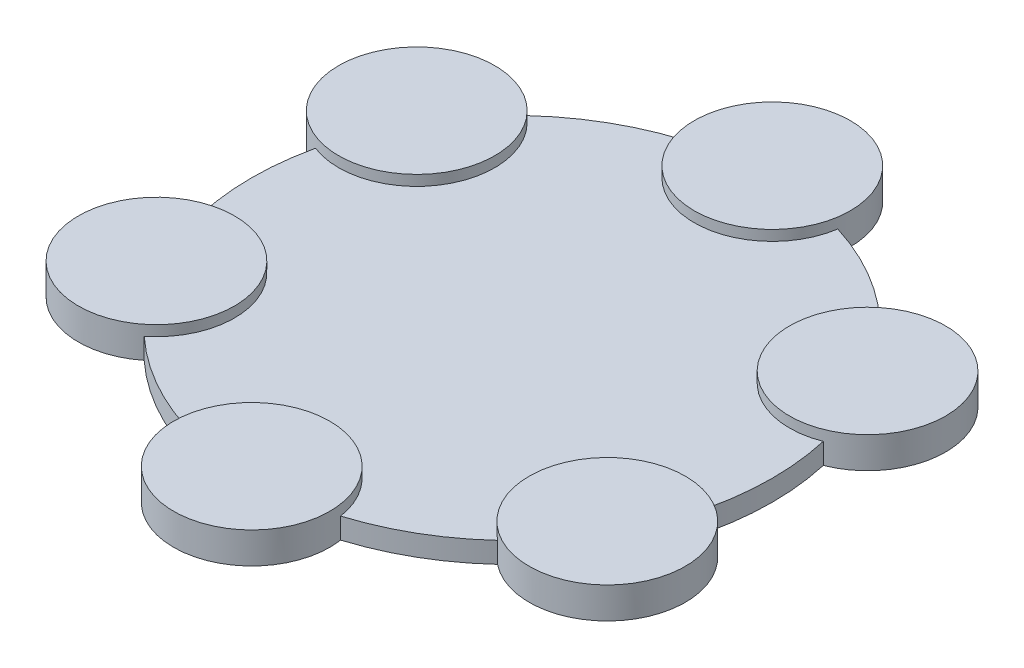
ISO-10303-21;
HEADER;
FILE_DESCRIPTION(('STEP AP214'),'2;1');
FILE_NAME('part.step','',(''),(''),'','','');
FILE_SCHEMA(('AUTOMOTIVE_DESIGN { 1 0 10303 214 1 1 1 1 }'));
ENDSEC;
DATA;
#1=APPLICATION_CONTEXT('core data for automotive mechanical design processes');
#2=APPLICATION_PROTOCOL_DEFINITION('international standard','automotive_design',2000,#1);
#3=PRODUCT_CONTEXT('',#1,'mechanical');
#4=PRODUCT('Part','Part','',(#3));
#5=PRODUCT_RELATED_PRODUCT_CATEGORY('part','',(#4));
#6=PRODUCT_DEFINITION_FORMATION('','',#4);
#7=PRODUCT_DEFINITION_CONTEXT('part definition',#1,'design');
#8=PRODUCT_DEFINITION('design','',#6,#7);
#9=PRODUCT_DEFINITION_SHAPE('','',#8);
#10=(LENGTH_UNIT() NAMED_UNIT(*) SI_UNIT(.MILLI.,.METRE.));
#11=(NAMED_UNIT(*) PLANE_ANGLE_UNIT() SI_UNIT($,.RADIAN.));
#12=(NAMED_UNIT(*) SI_UNIT($,.STERADIAN.) SOLID_ANGLE_UNIT());
#13=UNCERTAINTY_MEASURE_WITH_UNIT(LENGTH_MEASURE(1.E-05),#10,'distance_accuracy_value','');
#14=(GEOMETRIC_REPRESENTATION_CONTEXT(3) GLOBAL_UNCERTAINTY_ASSIGNED_CONTEXT((#13)) GLOBAL_UNIT_ASSIGNED_CONTEXT((#10,
#11,#12)) REPRESENTATION_CONTEXT('',''));
#15=CARTESIAN_POINT('',(0.,0.,0.));
#16=DIRECTION('',(0.,0.,1.));
#17=DIRECTION('',(1.,0.,0.));
#18=AXIS2_PLACEMENT_3D('',#15,#16,#17);
#19=CARTESIAN_POINT('',(0.,20.,0.));
#20=DIRECTION('',(0.,-1.,0.));
#21=DIRECTION('',(0.,0.,-1.));
#22=AXIS2_PLACEMENT_3D('',#19,#20,#21);
#23=CYLINDRICAL_SURFACE('',#22,250.);
#24=CARTESIAN_POINT('',(0.,0.,0.));
#25=DIRECTION('',(0.,1.,0.));
#26=DIRECTION('',(0.,0.,1.));
#27=AXIS2_PLACEMENT_3D('',#24,#25,#26);
#28=CIRCLE('',#27,250.);
#29=CARTESIAN_POINT('',(-243.839290028445,0.,-55.1579607892088));
#30=VERTEX_POINT('',#29);
#31=CARTESIAN_POINT('',(-243.839290028444,0.,55.1579607892139));
#32=VERTEX_POINT('',#31);
#33=EDGE_CURVE('E136',#30,#32,#28,.T.);
#34=ORIENTED_EDGE('',*,*,#33,.T.);
#35=DIRECTION('',(0.,-1.,0.));
#36=VECTOR('',#35,1.);
#37=CARTESIAN_POINT('',(-243.839290028444,15.,55.1579607892139));
#38=LINE('',#37,#36);
#39=CARTESIAN_POINT('',(-243.839290028444,20.,55.1579607892139));
#40=VERTEX_POINT('',#39);
#41=EDGE_CURVE('E134',#32,#40,#38,.F.);
#42=ORIENTED_EDGE('',*,*,#41,.T.);
#43=CARTESIAN_POINT('',(0.,20.,0.));
#44=DIRECTION('',(0.,1.,0.));
#45=DIRECTION('',(0.,0.,1.));
#46=AXIS2_PLACEMENT_3D('',#43,#44,#45);
#47=CIRCLE('',#46,250.);
#48=CARTESIAN_POINT('',(-243.839290028445,20.,-55.1579607892088));
#49=VERTEX_POINT('',#48);
#50=EDGE_CURVE('E125',#49,#40,#47,.T.);
#51=ORIENTED_EDGE('',*,*,#50,.F.);
#52=DIRECTION('',(0.,-1.,0.));
#53=VECTOR('',#52,1.);
#54=CARTESIAN_POINT('',(-243.839290028445,15.,-55.1579607892088));
#55=LINE('',#54,#53);
#56=EDGE_CURVE('E157',#49,#30,#55,.T.);
#57=ORIENTED_EDGE('',*,*,#56,.T.);
#58=EDGE_LOOP('',(#34,#42,#51,#57));
#59=FACE_BOUND('',#58,.T.);
#60=ADVANCED_FACE('F37',(#59),#23,.T.);
#61=CARTESIAN_POINT('',(-74.1514497498195,0.,-238.75));
#62=VERTEX_POINT('',#61);
#63=CARTESIAN_POINT('',(-169.687840278627,0.,-183.592039210787));
#64=VERTEX_POINT('',#63);
#65=EDGE_CURVE('E219',#62,#64,#28,.T.);
#66=ORIENTED_EDGE('',*,*,#65,.T.);
#67=DIRECTION('',(0.,-1.,0.));
#68=VECTOR('',#67,1.);
#69=CARTESIAN_POINT('',(-169.687840278627,15.,-183.592039210787));
#70=LINE('',#69,#68);
#71=CARTESIAN_POINT('',(-169.687840278627,20.,-183.592039210787));
#72=VERTEX_POINT('',#71);
#73=EDGE_CURVE('E159',#64,#72,#70,.F.);
#74=ORIENTED_EDGE('',*,*,#73,.T.);
#75=CARTESIAN_POINT('',(-74.1514497498195,20.,-238.75));
#76=VERTEX_POINT('',#75);
#77=EDGE_CURVE('E132',#76,#72,#47,.T.);
#78=ORIENTED_EDGE('',*,*,#77,.F.);
#79=DIRECTION('',(0.,-1.,0.));
#80=VECTOR('',#79,1.);
#81=CARTESIAN_POINT('',(-74.1514497498195,15.,-238.75));
#82=LINE('',#81,#80);
#83=EDGE_CURVE('E171',#76,#62,#82,.T.);
#84=ORIENTED_EDGE('',*,*,#83,.T.);
#85=EDGE_LOOP('',(#66,#74,#78,#84));
#86=FACE_BOUND('',#85,.T.);
#87=ADVANCED_FACE('F234',(#86),#23,.T.);
#88=CARTESIAN_POINT('',(169.687840278624,0.,-183.59203921079));
#89=VERTEX_POINT('',#88);
#90=CARTESIAN_POINT('',(74.1514497498195,0.,-238.75));
#91=VERTEX_POINT('',#90);
#92=EDGE_CURVE('E224',#89,#91,#28,.T.);
#93=ORIENTED_EDGE('',*,*,#92,.T.);
#94=DIRECTION('',(0.,-1.,0.));
#95=VECTOR('',#94,1.);
#96=CARTESIAN_POINT('',(74.1514497498195,15.,-238.75));
#97=LINE('',#96,#95);
#98=CARTESIAN_POINT('',(74.1514497498195,20.,-238.75));
#99=VERTEX_POINT('',#98);
#100=EDGE_CURVE('E173',#91,#99,#97,.F.);
#101=ORIENTED_EDGE('',*,*,#100,.T.);
#102=CARTESIAN_POINT('',(169.687840278624,20.,-183.59203921079));
#103=VERTEX_POINT('',#102);
#104=EDGE_CURVE('E255',#103,#99,#47,.T.);
#105=ORIENTED_EDGE('',*,*,#104,.F.);
#106=DIRECTION('',(0.,-1.,0.));
#107=VECTOR('',#106,1.);
#108=CARTESIAN_POINT('',(169.687840278624,15.,-183.59203921079));
#109=LINE('',#108,#107);
#110=EDGE_CURVE('E185',#103,#89,#109,.T.);
#111=ORIENTED_EDGE('',*,*,#110,.T.);
#112=EDGE_LOOP('',(#93,#101,#105,#111));
#113=FACE_BOUND('',#112,.T.);
#114=ADVANCED_FACE('F263',(#113),#23,.T.);
#115=CARTESIAN_POINT('',(243.839290028445,0.,55.1579607892105));
#116=VERTEX_POINT('',#115);
#117=CARTESIAN_POINT('',(243.839290028444,0.,-55.1579607892122));
#118=VERTEX_POINT('',#117);
#119=EDGE_CURVE('E220',#116,#118,#28,.T.);
#120=ORIENTED_EDGE('',*,*,#119,.T.);
#121=DIRECTION('',(0.,-1.,0.));
#122=VECTOR('',#121,1.);
#123=CARTESIAN_POINT('',(243.839290028444,15.,-55.1579607892122));
#124=LINE('',#123,#122);
#125=CARTESIAN_POINT('',(243.839290028444,20.,-55.1579607892122));
#126=VERTEX_POINT('',#125);
#127=EDGE_CURVE('E187',#118,#126,#124,.F.);
#128=ORIENTED_EDGE('',*,*,#127,.T.);
#129=CARTESIAN_POINT('',(243.839290028445,20.,55.1579607892105));
#130=VERTEX_POINT('',#129);
#131=EDGE_CURVE('E46',#130,#126,#47,.T.);
#132=ORIENTED_EDGE('',*,*,#131,.F.);
#133=DIRECTION('',(0.,-1.,0.));
#134=VECTOR('',#133,1.);
#135=CARTESIAN_POINT('',(243.839290028445,15.,55.1579607892105));
#136=LINE('',#135,#134);
#137=EDGE_CURVE('E199',#130,#116,#136,.T.);
#138=ORIENTED_EDGE('',*,*,#137,.T.);
#139=EDGE_LOOP('',(#120,#128,#132,#138));
#140=FACE_BOUND('',#139,.T.);
#141=ADVANCED_FACE('F254',(#140),#23,.T.);
#142=CARTESIAN_POINT('',(74.1514497498195,0.,238.75));
#143=VERTEX_POINT('',#142);
#144=CARTESIAN_POINT('',(169.687840278625,0.,183.592039210788));
#145=VERTEX_POINT('',#144);
#146=EDGE_CURVE('E41',#143,#145,#28,.T.);
#147=ORIENTED_EDGE('',*,*,#146,.T.);
#148=DIRECTION('',(0.,-1.,0.));
#149=VECTOR('',#148,1.);
#150=CARTESIAN_POINT('',(169.687840278625,15.,183.592039210789));
#151=LINE('',#150,#149);
#152=CARTESIAN_POINT('',(169.687840278625,20.,183.592039210788));
#153=VERTEX_POINT('',#152);
#154=EDGE_CURVE('E201',#145,#153,#151,.F.);
#155=ORIENTED_EDGE('',*,*,#154,.T.);
#156=CARTESIAN_POINT('',(74.1514497498195,20.,238.75));
#157=VERTEX_POINT('',#156);
#158=EDGE_CURVE('E11',#157,#153,#47,.T.);
#159=ORIENTED_EDGE('',*,*,#158,.F.);
#160=DIRECTION('',(0.,-1.,0.));
#161=VECTOR('',#160,1.);
#162=CARTESIAN_POINT('',(74.1514497498195,15.,238.75));
#163=LINE('',#162,#161);
#164=EDGE_CURVE('E213',#157,#143,#163,.T.);
#165=ORIENTED_EDGE('',*,*,#164,.T.);
#166=EDGE_LOOP('',(#147,#155,#159,#165));
#167=FACE_BOUND('',#166,.T.);
#168=ADVANCED_FACE('F248',(#167),#23,.T.);
#169=CARTESIAN_POINT('',(-169.687840278623,20.,183.592039210791));
#170=VERTEX_POINT('',#169);
#171=CARTESIAN_POINT('',(-74.1514497498195,20.,238.75));
#172=VERTEX_POINT('',#171);
#173=EDGE_CURVE('E47',#170,#172,#47,.T.);
#174=ORIENTED_EDGE('',*,*,#173,.F.);
#175=DIRECTION('',(0.,-1.,0.));
#176=VECTOR('',#175,1.);
#177=CARTESIAN_POINT('',(-169.687840278623,15.,183.592039210791));
#178=LINE('',#177,#176);
#179=CARTESIAN_POINT('',(-169.687840278623,0.,183.592039210791));
#180=VERTEX_POINT('',#179);
#181=EDGE_CURVE('E61',#170,#180,#178,.T.);
#182=ORIENTED_EDGE('',*,*,#181,.T.);
#183=CARTESIAN_POINT('',(-74.1514497498195,0.,238.75));
#184=VERTEX_POINT('',#183);
#185=EDGE_CURVE('E217',#180,#184,#28,.T.);
#186=ORIENTED_EDGE('',*,*,#185,.T.);
#187=DIRECTION('',(0.,-1.,0.));
#188=VECTOR('',#187,1.);
#189=CARTESIAN_POINT('',(-74.1514497498195,15.,238.75));
#190=LINE('',#189,#188);
#191=EDGE_CURVE('E215',#184,#172,#190,.F.);
#192=ORIENTED_EDGE('',*,*,#191,.T.);
#193=EDGE_LOOP('',(#174,#182,#186,#192));
#194=FACE_BOUND('',#193,.T.);
#195=ADVANCED_FACE('F39',(#194),#23,.T.);
#196=CARTESIAN_POINT('',(0.,20.,0.));
#197=DIRECTION('',(0.,1.,0.));
#198=DIRECTION('',(0.,0.,1.));
#199=AXIS2_PLACEMENT_3D('',#196,#197,#198);
#200=PLANE('',#199);
#201=CARTESIAN_POINT('',(-216.506350946108,20.,125.000000000003));
#202=DIRECTION('',(0.,1.,0.));
#203=DIRECTION('',(0.,0.,1.));
#204=AXIS2_PLACEMENT_3D('',#201,#202,#203);
#205=CIRCLE('',#204,75.);
#206=EDGE_CURVE('E54',#170,#40,#205,.T.);
#207=ORIENTED_EDGE('',*,*,#206,.F.);
#208=ORIENTED_EDGE('',*,*,#173,.T.);
#209=CARTESIAN_POINT('',(0.,20.,250.));
#210=DIRECTION('',(0.,1.,0.));
#211=DIRECTION('',(0.,0.,1.));
#212=AXIS2_PLACEMENT_3D('',#209,#210,#211);
#213=CIRCLE('',#212,75.);
#214=EDGE_CURVE('E208',#157,#172,#213,.T.);
#215=ORIENTED_EDGE('',*,*,#214,.F.);
#216=ORIENTED_EDGE('',*,*,#158,.T.);
#217=CARTESIAN_POINT('',(216.50635094611,20.,124.999999999999));
#218=DIRECTION('',(0.,1.,0.));
#219=DIRECTION('',(0.,0.,1.));
#220=AXIS2_PLACEMENT_3D('',#217,#218,#219);
#221=CIRCLE('',#220,75.);
#222=EDGE_CURVE('E194',#130,#153,#221,.T.);
#223=ORIENTED_EDGE('',*,*,#222,.F.);
#224=ORIENTED_EDGE('',*,*,#131,.T.);
#225=CARTESIAN_POINT('',(216.506350946109,20.,-125.000000000001));
#226=DIRECTION('',(0.,1.,0.));
#227=DIRECTION('',(0.,0.,1.));
#228=AXIS2_PLACEMENT_3D('',#225,#226,#227);
#229=CIRCLE('',#228,75.);
#230=EDGE_CURVE('E180',#103,#126,#229,.T.);
#231=ORIENTED_EDGE('',*,*,#230,.F.);
#232=ORIENTED_EDGE('',*,*,#104,.T.);
#233=CARTESIAN_POINT('',(0.,20.,-250.));
#234=DIRECTION('',(0.,1.,0.));
#235=DIRECTION('',(0.,0.,1.));
#236=AXIS2_PLACEMENT_3D('',#233,#234,#235);
#237=CIRCLE('',#236,75.);
#238=EDGE_CURVE('E166',#76,#99,#237,.T.);
#239=ORIENTED_EDGE('',*,*,#238,.F.);
#240=ORIENTED_EDGE('',*,*,#77,.T.);
#241=CARTESIAN_POINT('',(-216.506350946111,20.,-124.999999999998));
#242=DIRECTION('',(0.,1.,0.));
#243=DIRECTION('',(0.,0.,1.));
#244=AXIS2_PLACEMENT_3D('',#241,#242,#243);
#245=CIRCLE('',#244,75.);
#246=EDGE_CURVE('E129',#49,#72,#245,.T.);
#247=ORIENTED_EDGE('',*,*,#246,.F.);
#248=ORIENTED_EDGE('',*,*,#50,.T.);
#249=EDGE_LOOP('',(#207,#208,#215,#216,#223,#224,#231,#232,#239,#240,#247,#248));
#250=FACE_BOUND('',#249,.T.);
#251=ADVANCED_FACE('F127',(#250),#200,.T.);
#252=CARTESIAN_POINT('',(0.,0.,0.));
#253=DIRECTION('',(0.,1.,0.));
#254=DIRECTION('',(0.,0.,1.));
#255=AXIS2_PLACEMENT_3D('',#252,#253,#254);
#256=PLANE('',#255);
#257=ORIENTED_EDGE('',*,*,#185,.F.);
#258=CARTESIAN_POINT('',(-216.506350946108,0.,125.000000000003));
#259=DIRECTION('',(0.,-1.,0.));
#260=DIRECTION('',(0.866025403784433,0.,-0.50000000000001));
#261=AXIS2_PLACEMENT_3D('',#258,#259,#260);
#262=CIRCLE('',#261,75.);
#263=EDGE_CURVE('E147',#180,#32,#262,.T.);
#264=ORIENTED_EDGE('',*,*,#263,.T.);
#265=ORIENTED_EDGE('',*,*,#33,.F.);
#266=CARTESIAN_POINT('',(-216.506350946111,0.,-124.999999999998));
#267=DIRECTION('',(0.,-1.,0.));
#268=DIRECTION('',(0.866025403784443,0.,0.499999999999992));
#269=AXIS2_PLACEMENT_3D('',#266,#267,#268);
#270=CIRCLE('',#269,75.);
#271=EDGE_CURVE('E140',#30,#64,#270,.T.);
#272=ORIENTED_EDGE('',*,*,#271,.T.);
#273=ORIENTED_EDGE('',*,*,#65,.F.);
#274=CARTESIAN_POINT('',(0.,0.,-250.));
#275=DIRECTION('',(0.,-1.,0.));
#276=DIRECTION('',(0.,0.,1.));
#277=AXIS2_PLACEMENT_3D('',#274,#275,#276);
#278=CIRCLE('',#277,75.);
#279=EDGE_CURVE('E162',#62,#91,#278,.T.);
#280=ORIENTED_EDGE('',*,*,#279,.T.);
#281=ORIENTED_EDGE('',*,*,#92,.F.);
#282=CARTESIAN_POINT('',(216.506350946109,0.,-125.000000000001));
#283=DIRECTION('',(0.,-1.,0.));
#284=DIRECTION('',(-0.866025403784436,0.,0.500000000000004));
#285=AXIS2_PLACEMENT_3D('',#282,#283,#284);
#286=CIRCLE('',#285,75.);
#287=EDGE_CURVE('E176',#89,#118,#286,.T.);
#288=ORIENTED_EDGE('',*,*,#287,.T.);
#289=ORIENTED_EDGE('',*,*,#119,.F.);
#290=CARTESIAN_POINT('',(216.50635094611,0.,124.999999999999));
#291=DIRECTION('',(0.,-1.,0.));
#292=DIRECTION('',(-0.86602540378444,0.,-0.499999999999998));
#293=AXIS2_PLACEMENT_3D('',#290,#291,#292);
#294=CIRCLE('',#293,75.);
#295=EDGE_CURVE('E190',#116,#145,#294,.T.);
#296=ORIENTED_EDGE('',*,*,#295,.T.);
#297=ORIENTED_EDGE('',*,*,#146,.F.);
#298=CARTESIAN_POINT('',(0.,0.,250.));
#299=DIRECTION('',(0.,-1.,0.));
#300=DIRECTION('',(0.,0.,-1.));
#301=AXIS2_PLACEMENT_3D('',#298,#299,#300);
#302=CIRCLE('',#301,75.);
#303=EDGE_CURVE('E204',#143,#184,#302,.T.);
#304=ORIENTED_EDGE('',*,*,#303,.T.);
#305=EDGE_LOOP('',(#257,#264,#265,#272,#273,#280,#281,#288,#289,#296,#297,#304));
#306=FACE_BOUND('',#305,.T.);
#307=ADVANCED_FACE('F242',(#306),#256,.F.);
#308=CARTESIAN_POINT('',(0.,30.,250.));
#309=DIRECTION('',(0.,-1.,0.));
#310=DIRECTION('',(0.,0.,-1.));
#311=AXIS2_PLACEMENT_3D('',#308,#309,#310);
#312=CYLINDRICAL_SURFACE('',#311,75.);
#313=CARTESIAN_POINT('',(0.,30.,250.));
#314=DIRECTION('',(0.,-1.,0.));
#315=DIRECTION('',(0.,0.,-1.));
#316=AXIS2_PLACEMENT_3D('',#313,#314,#315);
#317=CIRCLE('',#316,75.);
#318=CARTESIAN_POINT('',(0.,30.,175.));
#319=VERTEX_POINT('',#318);
#320=EDGE_CURVE('E205',#319,#319,#317,.T.);
#321=ORIENTED_EDGE('',*,*,#320,.T.);
#322=EDGE_LOOP('',(#321));
#323=FACE_BOUND('',#322,.T.);
#324=ORIENTED_EDGE('',*,*,#191,.F.);
#325=ORIENTED_EDGE('',*,*,#303,.F.);
#326=ORIENTED_EDGE('',*,*,#164,.F.);
#327=ORIENTED_EDGE('',*,*,#214,.T.);
#328=EDGE_LOOP('',(#324,#325,#326,#327));
#329=FACE_BOUND('',#328,.T.);
#330=ADVANCED_FACE('F246',(#323,#329),#312,.T.);
#331=CARTESIAN_POINT('',(0.,30.,250.));
#332=DIRECTION('',(0.,-1.,0.));
#333=DIRECTION('',(0.,0.,-1.));
#334=AXIS2_PLACEMENT_3D('',#331,#332,#333);
#335=PLANE('',#334);
#336=ORIENTED_EDGE('',*,*,#320,.F.);
#337=EDGE_LOOP('',(#336));
#338=FACE_BOUND('',#337,.T.);
#339=ADVANCED_FACE('F304',(#338),#335,.F.);
#340=CARTESIAN_POINT('',(216.50635094611,30.,124.999999999999));
#341=DIRECTION('',(0.,-1.,0.));
#342=DIRECTION('',(0.,0.,-1.));
#343=AXIS2_PLACEMENT_3D('',#340,#341,#342);
#344=CYLINDRICAL_SURFACE('',#343,75.);
#345=CARTESIAN_POINT('',(216.50635094611,30.,124.999999999999));
#346=DIRECTION('',(0.,-1.,0.));
#347=DIRECTION('',(-0.86602540378444,0.,-0.499999999999998));
#348=AXIS2_PLACEMENT_3D('',#345,#346,#347);
#349=CIRCLE('',#348,75.);
#350=CARTESIAN_POINT('',(151.554445662277,30.,87.4999999999996));
#351=VERTEX_POINT('',#350);
#352=EDGE_CURVE('E191',#351,#351,#349,.T.);
#353=ORIENTED_EDGE('',*,*,#352,.T.);
#354=EDGE_LOOP('',(#353));
#355=FACE_BOUND('',#354,.T.);
#356=ORIENTED_EDGE('',*,*,#154,.F.);
#357=ORIENTED_EDGE('',*,*,#295,.F.);
#358=ORIENTED_EDGE('',*,*,#137,.F.);
#359=ORIENTED_EDGE('',*,*,#222,.T.);
#360=EDGE_LOOP('',(#356,#357,#358,#359));
#361=FACE_BOUND('',#360,.T.);
#362=ADVANCED_FACE('F252',(#355,#361),#344,.T.);
#363=CARTESIAN_POINT('',(216.50635094611,30.,124.999999999999));
#364=DIRECTION('',(0.,-1.,0.));
#365=DIRECTION('',(-0.86602540378444,0.,-0.499999999999998));
#366=AXIS2_PLACEMENT_3D('',#363,#364,#365);
#367=PLANE('',#366);
#368=ORIENTED_EDGE('',*,*,#352,.F.);
#369=EDGE_LOOP('',(#368));
#370=FACE_BOUND('',#369,.T.);
#371=ADVANCED_FACE('F362',(#370),#367,.F.);
#372=CARTESIAN_POINT('',(216.506350946109,30.,-125.000000000001));
#373=DIRECTION('',(0.,-1.,0.));
#374=DIRECTION('',(0.,0.,-1.));
#375=AXIS2_PLACEMENT_3D('',#372,#373,#374);
#376=CYLINDRICAL_SURFACE('',#375,75.);
#377=CARTESIAN_POINT('',(216.506350946109,30.,-125.000000000001));
#378=DIRECTION('',(0.,-1.,0.));
#379=DIRECTION('',(-0.866025403784436,0.,0.500000000000004));
#380=AXIS2_PLACEMENT_3D('',#377,#378,#379);
#381=CIRCLE('',#380,75.);
#382=CARTESIAN_POINT('',(151.554445662276,30.,-87.5000000000007));
#383=VERTEX_POINT('',#382);
#384=EDGE_CURVE('E177',#383,#383,#381,.T.);
#385=ORIENTED_EDGE('',*,*,#384,.T.);
#386=EDGE_LOOP('',(#385));
#387=FACE_BOUND('',#386,.T.);
#388=ORIENTED_EDGE('',*,*,#127,.F.);
#389=ORIENTED_EDGE('',*,*,#287,.F.);
#390=ORIENTED_EDGE('',*,*,#110,.F.);
#391=ORIENTED_EDGE('',*,*,#230,.T.);
#392=EDGE_LOOP('',(#388,#389,#390,#391));
#393=FACE_BOUND('',#392,.T.);
#394=ADVANCED_FACE('F262',(#387,#393),#376,.T.);
#395=CARTESIAN_POINT('',(216.506350946109,30.,-125.000000000001));
#396=DIRECTION('',(0.,-1.,0.));
#397=DIRECTION('',(-0.866025403784436,0.,0.500000000000004));
#398=AXIS2_PLACEMENT_3D('',#395,#396,#397);
#399=PLANE('',#398);
#400=ORIENTED_EDGE('',*,*,#384,.F.);
#401=EDGE_LOOP('',(#400));
#402=FACE_BOUND('',#401,.T.);
#403=ADVANCED_FACE('F379',(#402),#399,.F.);
#404=CARTESIAN_POINT('',(0.,30.,-250.));
#405=DIRECTION('',(0.,-1.,0.));
#406=DIRECTION('',(0.,0.,-1.));
#407=AXIS2_PLACEMENT_3D('',#404,#405,#406);
#408=CYLINDRICAL_SURFACE('',#407,75.);
#409=CARTESIAN_POINT('',(0.,30.,-250.));
#410=DIRECTION('',(0.,-1.,0.));
#411=DIRECTION('',(0.,0.,1.));
#412=AXIS2_PLACEMENT_3D('',#409,#410,#411);
#413=CIRCLE('',#412,75.);
#414=CARTESIAN_POINT('',(0.,30.,-175.));
#415=VERTEX_POINT('',#414);
#416=EDGE_CURVE('E163',#415,#415,#413,.T.);
#417=ORIENTED_EDGE('',*,*,#416,.T.);
#418=EDGE_LOOP('',(#417));
#419=FACE_BOUND('',#418,.T.);
#420=ORIENTED_EDGE('',*,*,#100,.F.);
#421=ORIENTED_EDGE('',*,*,#279,.F.);
#422=ORIENTED_EDGE('',*,*,#83,.F.);
#423=ORIENTED_EDGE('',*,*,#238,.T.);
#424=EDGE_LOOP('',(#420,#421,#422,#423));
#425=FACE_BOUND('',#424,.T.);
#426=ADVANCED_FACE('F258',(#419,#425),#408,.T.);
#427=CARTESIAN_POINT('',(0.,30.,-250.));
#428=DIRECTION('',(0.,-1.,0.));
#429=DIRECTION('',(0.,0.,1.));
#430=AXIS2_PLACEMENT_3D('',#427,#428,#429);
#431=PLANE('',#430);
#432=ORIENTED_EDGE('',*,*,#416,.F.);
#433=EDGE_LOOP('',(#432));
#434=FACE_BOUND('',#433,.T.);
#435=ADVANCED_FACE('F396',(#434),#431,.F.);
#436=CARTESIAN_POINT('',(-216.506350946111,30.,-124.999999999998));
#437=DIRECTION('',(0.,-1.,0.));
#438=DIRECTION('',(0.,0.,-1.));
#439=AXIS2_PLACEMENT_3D('',#436,#437,#438);
#440=CYLINDRICAL_SURFACE('',#439,75.);
#441=CARTESIAN_POINT('',(-216.506350946111,30.,-124.999999999998));
#442=DIRECTION('',(0.,-1.,0.));
#443=DIRECTION('',(0.866025403784443,0.,0.499999999999992));
#444=AXIS2_PLACEMENT_3D('',#441,#442,#443);
#445=CIRCLE('',#444,75.);
#446=CARTESIAN_POINT('',(-151.554445662277,30.,-87.4999999999986));
#447=VERTEX_POINT('',#446);
#448=EDGE_CURVE('E151',#447,#447,#445,.T.);
#449=ORIENTED_EDGE('',*,*,#448,.T.);
#450=EDGE_LOOP('',(#449));
#451=FACE_BOUND('',#450,.T.);
#452=ORIENTED_EDGE('',*,*,#73,.F.);
#453=ORIENTED_EDGE('',*,*,#271,.F.);
#454=ORIENTED_EDGE('',*,*,#56,.F.);
#455=ORIENTED_EDGE('',*,*,#246,.T.);
#456=EDGE_LOOP('',(#452,#453,#454,#455));
#457=FACE_BOUND('',#456,.T.);
#458=ADVANCED_FACE('F241',(#451,#457),#440,.T.);
#459=CARTESIAN_POINT('',(-216.506350946111,30.,-124.999999999998));
#460=DIRECTION('',(0.,-1.,0.));
#461=DIRECTION('',(0.866025403784443,0.,0.499999999999992));
#462=AXIS2_PLACEMENT_3D('',#459,#460,#461);
#463=PLANE('',#462);
#464=ORIENTED_EDGE('',*,*,#448,.F.);
#465=EDGE_LOOP('',(#464));
#466=FACE_BOUND('',#465,.T.);
#467=ADVANCED_FACE('F413',(#466),#463,.F.);
#468=CARTESIAN_POINT('',(-216.506350946108,30.,125.000000000003));
#469=DIRECTION('',(0.,-1.,0.));
#470=DIRECTION('',(0.,0.,-1.));
#471=AXIS2_PLACEMENT_3D('',#468,#469,#470);
#472=CYLINDRICAL_SURFACE('',#471,75.);
#473=CARTESIAN_POINT('',(-216.506350946108,30.,125.000000000003));
#474=DIRECTION('',(0.,-1.,0.));
#475=DIRECTION('',(0.866025403784433,0.,-0.50000000000001));
#476=AXIS2_PLACEMENT_3D('',#473,#474,#475);
#477=CIRCLE('',#476,75.);
#478=CARTESIAN_POINT('',(-151.554445662276,30.,87.5000000000017));
#479=VERTEX_POINT('',#478);
#480=EDGE_CURVE('E143',#479,#479,#477,.T.);
#481=ORIENTED_EDGE('',*,*,#480,.T.);
#482=EDGE_LOOP('',(#481));
#483=FACE_BOUND('',#482,.T.);
#484=ORIENTED_EDGE('',*,*,#41,.F.);
#485=ORIENTED_EDGE('',*,*,#263,.F.);
#486=ORIENTED_EDGE('',*,*,#181,.F.);
#487=ORIENTED_EDGE('',*,*,#206,.T.);
#488=EDGE_LOOP('',(#484,#485,#486,#487));
#489=FACE_BOUND('',#488,.T.);
#490=ADVANCED_FACE('F142',(#483,#489),#472,.T.);
#491=CARTESIAN_POINT('',(-216.506350946108,30.,125.000000000003));
#492=DIRECTION('',(0.,-1.,0.));
#493=DIRECTION('',(0.866025403784433,0.,-0.50000000000001));
#494=AXIS2_PLACEMENT_3D('',#491,#492,#493);
#495=PLANE('',#494);
#496=ORIENTED_EDGE('',*,*,#480,.F.);
#497=EDGE_LOOP('',(#496));
#498=FACE_BOUND('',#497,.T.);
#499=ADVANCED_FACE('F430',(#498),#495,.F.);
#500=CLOSED_SHELL('',(#60,#87,#114,#141,#168,#195,#251,#307,#330,#339,#362,#371,#394,#403,#426,
#435,#458,#467,#490,#499));
#501=MANIFOLD_SOLID_BREP('B2',#500);
#502=ADVANCED_BREP_SHAPE_REPRESENTATION('',(#18,#501),#14);
#503=SHAPE_DEFINITION_REPRESENTATION(#9,#502);
ENDSEC;
END-ISO-10303-21;
